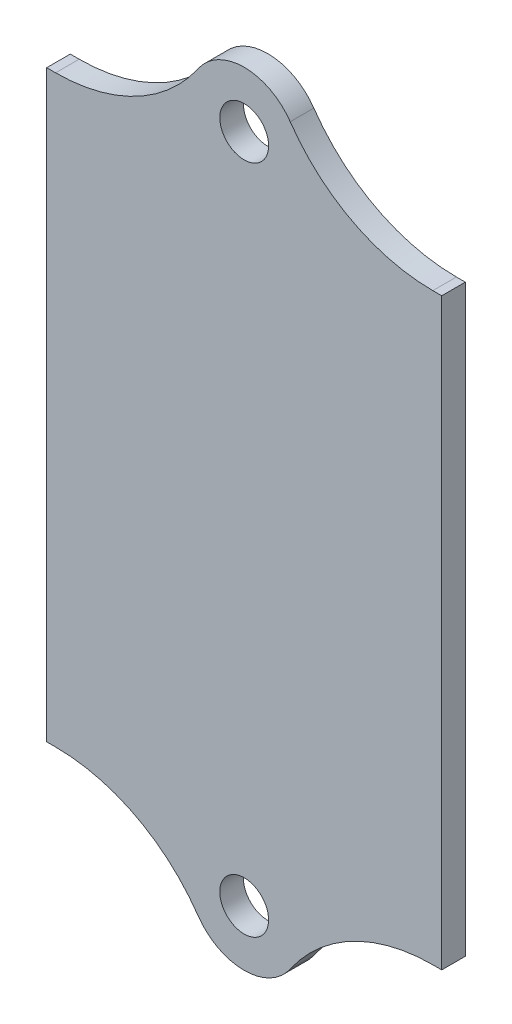
ISO-10303-21;
HEADER;
FILE_DESCRIPTION(('STEP AP214'),'2;1');
FILE_NAME('part.step','',(''),(''),'','','');
FILE_SCHEMA(('AUTOMOTIVE_DESIGN { 1 0 10303 214 1 1 1 1 }'));
ENDSEC;
DATA;
#1=APPLICATION_CONTEXT('core data for automotive mechanical design processes');
#2=APPLICATION_PROTOCOL_DEFINITION('international standard','automotive_design',2000,#1);
#3=PRODUCT_CONTEXT('',#1,'mechanical');
#4=PRODUCT('Part','Part','',(#3));
#5=PRODUCT_RELATED_PRODUCT_CATEGORY('part','',(#4));
#6=PRODUCT_DEFINITION_FORMATION('','',#4);
#7=PRODUCT_DEFINITION_CONTEXT('part definition',#1,'design');
#8=PRODUCT_DEFINITION('design','',#6,#7);
#9=PRODUCT_DEFINITION_SHAPE('','',#8);
#10=(LENGTH_UNIT() NAMED_UNIT(*) SI_UNIT(.MILLI.,.METRE.));
#11=(NAMED_UNIT(*) PLANE_ANGLE_UNIT() SI_UNIT($,.RADIAN.));
#12=(NAMED_UNIT(*) SI_UNIT($,.STERADIAN.) SOLID_ANGLE_UNIT());
#13=UNCERTAINTY_MEASURE_WITH_UNIT(LENGTH_MEASURE(1.E-05),#10,'distance_accuracy_value','');
#14=(GEOMETRIC_REPRESENTATION_CONTEXT(3) GLOBAL_UNCERTAINTY_ASSIGNED_CONTEXT((#13)) GLOBAL_UNIT_ASSIGNED_CONTEXT((#10,
#11,#12)) REPRESENTATION_CONTEXT('',''));
#15=CARTESIAN_POINT('',(0.,0.,0.));
#16=DIRECTION('',(0.,0.,1.));
#17=DIRECTION('',(1.,0.,0.));
#18=AXIS2_PLACEMENT_3D('',#15,#16,#17);
#19=CARTESIAN_POINT('',(14.1836690318087,56.1,1.5));
#20=DIRECTION('',(0.,0.,-1.));
#21=DIRECTION('',(-1.,0.,0.));
#22=AXIS2_PLACEMENT_3D('',#19,#20,#21);
#23=CYLINDRICAL_SURFACE('',#22,11.);
#24=CARTESIAN_POINT('',(14.1836690318087,56.1,0.));
#25=DIRECTION('',(0.,0.,-1.));
#26=DIRECTION('',(1.,0.,0.));
#27=AXIS2_PLACEMENT_3D('',#24,#25,#26);
#28=CIRCLE('',#27,11.);
#29=CARTESIAN_POINT('',(14.1836690318087,45.1,0.));
#30=VERTEX_POINT('',#29);
#31=CARTESIAN_POINT('',(5.12285138604295,49.8628865979381,0.));
#32=VERTEX_POINT('',#31);
#33=EDGE_CURVE('E156',#30,#32,#28,.T.);
#34=ORIENTED_EDGE('',*,*,#33,.T.);
#35=DIRECTION('',(0.,0.,-1.));
#36=VECTOR('',#35,1.);
#37=CARTESIAN_POINT('',(5.12285138604295,49.8628865979381,1.5));
#38=LINE('',#37,#36);
#39=CARTESIAN_POINT('',(5.12285138604295,49.8628865979381,1.5));
#40=VERTEX_POINT('',#39);
#41=EDGE_CURVE('E11',#40,#32,#38,.T.);
#42=ORIENTED_EDGE('',*,*,#41,.F.);
#43=CARTESIAN_POINT('',(14.1836690318087,56.1,1.5));
#44=DIRECTION('',(0.,0.,-1.));
#45=DIRECTION('',(1.,0.,0.));
#46=AXIS2_PLACEMENT_3D('',#43,#44,#45);
#47=CIRCLE('',#46,11.);
#48=CARTESIAN_POINT('',(14.1836690318087,45.1,1.5));
#49=VERTEX_POINT('',#48);
#50=EDGE_CURVE('E181',#49,#40,#47,.T.);
#51=ORIENTED_EDGE('',*,*,#50,.F.);
#52=DIRECTION('',(0.,0.,-1.));
#53=VECTOR('',#52,1.);
#54=CARTESIAN_POINT('',(14.1836690318087,45.1,1.5));
#55=LINE('',#54,#53);
#56=EDGE_CURVE('E152',#49,#30,#55,.T.);
#57=ORIENTED_EDGE('',*,*,#56,.T.);
#58=EDGE_LOOP('',(#34,#42,#51,#57));
#59=FACE_BOUND('',#58,.T.);
#60=ADVANCED_FACE('F35',(#59),#23,.F.);
#61=CARTESIAN_POINT('',(2.19867841854582,47.85,1.5));
#62=DIRECTION('',(0.,0.,-1.));
#63=DIRECTION('',(-1.,0.,0.));
#64=AXIS2_PLACEMENT_3D('',#61,#62,#63);
#65=CYLINDRICAL_SURFACE('',#64,3.55);
#66=CARTESIAN_POINT('',(2.19867841854582,47.85,0.));
#67=DIRECTION('',(0.,0.,1.));
#68=DIRECTION('',(1.,0.,0.));
#69=AXIS2_PLACEMENT_3D('',#66,#67,#68);
#70=CIRCLE('',#69,3.55);
#71=CARTESIAN_POINT('',(-0.725494548951331,49.8628865979381,0.));
#72=VERTEX_POINT('',#71);
#73=EDGE_CURVE('E159',#32,#72,#70,.T.);
#74=ORIENTED_EDGE('',*,*,#73,.T.);
#75=DIRECTION('',(0.,0.,-1.));
#76=VECTOR('',#75,1.);
#77=CARTESIAN_POINT('',(-0.725494548951331,49.8628865979381,1.5));
#78=LINE('',#77,#76);
#79=CARTESIAN_POINT('',(-0.725494548951331,49.8628865979381,1.5));
#80=VERTEX_POINT('',#79);
#81=EDGE_CURVE('E43',#80,#72,#78,.T.);
#82=ORIENTED_EDGE('',*,*,#81,.F.);
#83=CARTESIAN_POINT('',(2.19867841854582,47.85,1.5));
#84=DIRECTION('',(0.,0.,1.));
#85=DIRECTION('',(1.,0.,0.));
#86=AXIS2_PLACEMENT_3D('',#83,#84,#85);
#87=CIRCLE('',#86,3.55);
#88=EDGE_CURVE('E103',#40,#80,#87,.T.);
#89=ORIENTED_EDGE('',*,*,#88,.F.);
#90=ORIENTED_EDGE('',*,*,#41,.T.);
#91=EDGE_LOOP('',(#74,#82,#89,#90));
#92=FACE_BOUND('',#91,.T.);
#93=ADVANCED_FACE('F284',(#92),#65,.T.);
#94=CARTESIAN_POINT('',(-9.78631219471709,56.1,1.5));
#95=DIRECTION('',(0.,0.,-1.));
#96=DIRECTION('',(-1.,0.,0.));
#97=AXIS2_PLACEMENT_3D('',#94,#95,#96);
#98=CYLINDRICAL_SURFACE('',#97,11.);
#99=CARTESIAN_POINT('',(-9.78631219471709,56.1,0.));
#100=DIRECTION('',(0.,0.,-1.));
#101=DIRECTION('',(1.,0.,0.));
#102=AXIS2_PLACEMENT_3D('',#99,#100,#101);
#103=CIRCLE('',#102,11.);
#104=CARTESIAN_POINT('',(-9.78631219471709,45.1,0.));
#105=VERTEX_POINT('',#104);
#106=EDGE_CURVE('E162',#72,#105,#103,.T.);
#107=ORIENTED_EDGE('',*,*,#106,.T.);
#108=DIRECTION('',(0.,0.,-1.));
#109=VECTOR('',#108,1.);
#110=CARTESIAN_POINT('',(-9.78631219471709,45.1,1.5));
#111=LINE('',#110,#109);
#112=CARTESIAN_POINT('',(-9.78631219471709,45.1,1.5));
#113=VERTEX_POINT('',#112);
#114=EDGE_CURVE('E200',#113,#105,#111,.T.);
#115=ORIENTED_EDGE('',*,*,#114,.F.);
#116=CARTESIAN_POINT('',(-9.78631219471709,56.1,1.5));
#117=DIRECTION('',(0.,0.,-1.));
#118=DIRECTION('',(1.,0.,0.));
#119=AXIS2_PLACEMENT_3D('',#116,#117,#118);
#120=CIRCLE('',#119,11.);
#121=EDGE_CURVE('E208',#80,#113,#120,.T.);
#122=ORIENTED_EDGE('',*,*,#121,.F.);
#123=ORIENTED_EDGE('',*,*,#81,.T.);
#124=EDGE_LOOP('',(#107,#115,#122,#123));
#125=FACE_BOUND('',#124,.T.);
#126=ADVANCED_FACE('F206',(#125),#98,.F.);
#127=CARTESIAN_POINT('',(-9.92567723443631,45.1,1.5));
#128=DIRECTION('',(0.,-1.,0.));
#129=DIRECTION('',(0.,0.,-1.));
#130=AXIS2_PLACEMENT_3D('',#127,#128,#129);
#131=PLANE('',#130);
#132=DIRECTION('',(-1.,0.,0.));
#133=VECTOR('',#132,1.);
#134=CARTESIAN_POINT('',(-9.92567723443631,45.1,0.));
#135=LINE('',#134,#133);
#136=CARTESIAN_POINT('',(-10.3513215814542,45.1,0.));
#137=VERTEX_POINT('',#136);
#138=EDGE_CURVE('E165',#105,#137,#135,.T.);
#139=ORIENTED_EDGE('',*,*,#138,.T.);
#140=DIRECTION('',(0.,0.,-1.));
#141=VECTOR('',#140,1.);
#142=CARTESIAN_POINT('',(-10.3513215814542,45.1,1.5));
#143=LINE('',#142,#141);
#144=CARTESIAN_POINT('',(-10.3513215814542,45.1,1.5));
#145=VERTEX_POINT('',#144);
#146=EDGE_CURVE('E197',#145,#137,#143,.T.);
#147=ORIENTED_EDGE('',*,*,#146,.F.);
#148=DIRECTION('',(-1.,0.,0.));
#149=VECTOR('',#148,1.);
#150=CARTESIAN_POINT('',(-9.78631219471709,45.1,1.5));
#151=LINE('',#150,#149);
#152=EDGE_CURVE('E223',#113,#145,#151,.T.);
#153=ORIENTED_EDGE('',*,*,#152,.F.);
#154=ORIENTED_EDGE('',*,*,#114,.T.);
#155=EDGE_LOOP('',(#139,#147,#153,#154));
#156=FACE_BOUND('',#155,.T.);
#157=ADVANCED_FACE('F214',(#156),#131,.F.);
#158=CARTESIAN_POINT('',(-10.3513215814542,8.,1.5));
#159=DIRECTION('',(1.,0.,0.));
#160=DIRECTION('',(0.,1.,0.));
#161=AXIS2_PLACEMENT_3D('',#158,#159,#160);
#162=PLANE('',#161);
#163=DIRECTION('',(0.,-1.,0.));
#164=VECTOR('',#163,1.);
#165=CARTESIAN_POINT('',(-10.3513215814542,8.,0.));
#166=LINE('',#165,#164);
#167=CARTESIAN_POINT('',(-10.3513215814542,8.,0.));
#168=VERTEX_POINT('',#167);
#169=EDGE_CURVE('E167',#137,#168,#166,.T.);
#170=ORIENTED_EDGE('',*,*,#169,.T.);
#171=DIRECTION('',(0.,0.,-1.));
#172=VECTOR('',#171,1.);
#173=CARTESIAN_POINT('',(-10.3513215814542,8.,1.5));
#174=LINE('',#173,#172);
#175=CARTESIAN_POINT('',(-10.3513215814542,8.,1.5));
#176=VERTEX_POINT('',#175);
#177=EDGE_CURVE('E194',#176,#168,#174,.T.);
#178=ORIENTED_EDGE('',*,*,#177,.F.);
#179=DIRECTION('',(0.,-1.,0.));
#180=VECTOR('',#179,1.);
#181=CARTESIAN_POINT('',(-10.3513215814542,8.,1.5));
#182=LINE('',#181,#180);
#183=EDGE_CURVE('E220',#145,#176,#182,.T.);
#184=ORIENTED_EDGE('',*,*,#183,.F.);
#185=ORIENTED_EDGE('',*,*,#146,.T.);
#186=EDGE_LOOP('',(#170,#178,#184,#185));
#187=FACE_BOUND('',#186,.T.);
#188=ADVANCED_FACE('F218',(#187),#162,.F.);
#189=CARTESIAN_POINT('',(-10.3513215814542,8.,1.5));
#190=DIRECTION('',(0.,1.,0.));
#191=DIRECTION('',(-1.,0.,0.));
#192=AXIS2_PLACEMENT_3D('',#189,#190,#191);
#193=PLANE('',#192);
#194=DIRECTION('',(1.,0.,0.));
#195=VECTOR('',#194,1.);
#196=CARTESIAN_POINT('',(-10.3513215814542,8.,0.));
#197=LINE('',#196,#195);
#198=CARTESIAN_POINT('',(-9.78631219471708,8.,0.));
#199=VERTEX_POINT('',#198);
#200=EDGE_CURVE('E169',#168,#199,#197,.T.);
#201=ORIENTED_EDGE('',*,*,#200,.T.);
#202=DIRECTION('',(0.,0.,-1.));
#203=VECTOR('',#202,1.);
#204=CARTESIAN_POINT('',(-9.78631219471708,8.,1.5));
#205=LINE('',#204,#203);
#206=CARTESIAN_POINT('',(-9.78631219471708,8.,1.5));
#207=VERTEX_POINT('',#206);
#208=EDGE_CURVE('E191',#207,#199,#205,.T.);
#209=ORIENTED_EDGE('',*,*,#208,.F.);
#210=DIRECTION('',(1.,0.,0.));
#211=VECTOR('',#210,1.);
#212=CARTESIAN_POINT('',(-10.3513215814542,8.,1.5));
#213=LINE('',#212,#211);
#214=EDGE_CURVE('E222',#176,#207,#213,.T.);
#215=ORIENTED_EDGE('',*,*,#214,.F.);
#216=ORIENTED_EDGE('',*,*,#177,.T.);
#217=EDGE_LOOP('',(#201,#209,#215,#216));
#218=FACE_BOUND('',#217,.T.);
#219=ADVANCED_FACE('F297',(#218),#193,.F.);
#220=CARTESIAN_POINT('',(-9.78631219471708,-3.,1.5));
#221=DIRECTION('',(0.,0.,-1.));
#222=DIRECTION('',(-1.,0.,0.));
#223=AXIS2_PLACEMENT_3D('',#220,#221,#222);
#224=CYLINDRICAL_SURFACE('',#223,11.);
#225=CARTESIAN_POINT('',(-9.78631219471708,-3.,0.));
#226=DIRECTION('',(0.,0.,-1.));
#227=DIRECTION('',(1.,0.,0.));
#228=AXIS2_PLACEMENT_3D('',#225,#226,#227);
#229=CIRCLE('',#228,11.);
#230=CARTESIAN_POINT('',(-0.725494548951317,3.23711340206186,0.));
#231=VERTEX_POINT('',#230);
#232=EDGE_CURVE('E171',#199,#231,#229,.T.);
#233=ORIENTED_EDGE('',*,*,#232,.T.);
#234=DIRECTION('',(0.,0.,-1.));
#235=VECTOR('',#234,1.);
#236=CARTESIAN_POINT('',(-0.725494548951317,3.23711340206186,1.5));
#237=LINE('',#236,#235);
#238=CARTESIAN_POINT('',(-0.725494548951317,3.23711340206186,1.5));
#239=VERTEX_POINT('',#238);
#240=EDGE_CURVE('E188',#239,#231,#237,.T.);
#241=ORIENTED_EDGE('',*,*,#240,.F.);
#242=CARTESIAN_POINT('',(-9.78631219471708,-3.,1.5));
#243=DIRECTION('',(0.,0.,-1.));
#244=DIRECTION('',(1.,0.,0.));
#245=AXIS2_PLACEMENT_3D('',#242,#243,#244);
#246=CIRCLE('',#245,11.);
#247=EDGE_CURVE('E225',#207,#239,#246,.T.);
#248=ORIENTED_EDGE('',*,*,#247,.F.);
#249=ORIENTED_EDGE('',*,*,#208,.T.);
#250=EDGE_LOOP('',(#233,#241,#248,#249));
#251=FACE_BOUND('',#250,.T.);
#252=ADVANCED_FACE('F300',(#251),#224,.F.);
#253=CARTESIAN_POINT('',(2.19867841854582,5.25,1.5));
#254=DIRECTION('',(0.,0.,-1.));
#255=DIRECTION('',(-1.,0.,0.));
#256=AXIS2_PLACEMENT_3D('',#253,#254,#255);
#257=CYLINDRICAL_SURFACE('',#256,3.55);
#258=CARTESIAN_POINT('',(2.19867841854582,5.25,0.));
#259=DIRECTION('',(0.,0.,1.));
#260=DIRECTION('',(1.,0.,0.));
#261=AXIS2_PLACEMENT_3D('',#258,#259,#260);
#262=CIRCLE('',#261,3.55);
#263=CARTESIAN_POINT('',(5.12285138604295,3.23711340206186,0.));
#264=VERTEX_POINT('',#263);
#265=EDGE_CURVE('E173',#231,#264,#262,.T.);
#266=ORIENTED_EDGE('',*,*,#265,.T.);
#267=DIRECTION('',(0.,0.,-1.));
#268=VECTOR('',#267,1.);
#269=CARTESIAN_POINT('',(5.12285138604295,3.23711340206186,1.5));
#270=LINE('',#269,#268);
#271=CARTESIAN_POINT('',(5.12285138604295,3.23711340206186,1.5));
#272=VERTEX_POINT('',#271);
#273=EDGE_CURVE('E185',#272,#264,#270,.T.);
#274=ORIENTED_EDGE('',*,*,#273,.F.);
#275=CARTESIAN_POINT('',(2.19867841854582,5.25,1.5));
#276=DIRECTION('',(0.,0.,1.));
#277=DIRECTION('',(1.,0.,0.));
#278=AXIS2_PLACEMENT_3D('',#275,#276,#277);
#279=CIRCLE('',#278,3.55);
#280=EDGE_CURVE('E231',#239,#272,#279,.T.);
#281=ORIENTED_EDGE('',*,*,#280,.F.);
#282=ORIENTED_EDGE('',*,*,#240,.T.);
#283=EDGE_LOOP('',(#266,#274,#281,#282));
#284=FACE_BOUND('',#283,.T.);
#285=ADVANCED_FACE('F237',(#284),#257,.T.);
#286=CARTESIAN_POINT('',(14.1836690318087,-3.,1.5));
#287=DIRECTION('',(0.,0.,-1.));
#288=DIRECTION('',(-1.,0.,0.));
#289=AXIS2_PLACEMENT_3D('',#286,#287,#288);
#290=CYLINDRICAL_SURFACE('',#289,11.);
#291=CARTESIAN_POINT('',(14.1836690318087,-3.,0.));
#292=DIRECTION('',(0.,0.,-1.));
#293=DIRECTION('',(1.,0.,0.));
#294=AXIS2_PLACEMENT_3D('',#291,#292,#293);
#295=CIRCLE('',#294,11.);
#296=CARTESIAN_POINT('',(14.1836690318087,8.,0.));
#297=VERTEX_POINT('',#296);
#298=EDGE_CURVE('E175',#264,#297,#295,.T.);
#299=ORIENTED_EDGE('',*,*,#298,.T.);
#300=DIRECTION('',(0.,0.,-1.));
#301=VECTOR('',#300,1.);
#302=CARTESIAN_POINT('',(14.1836690318087,8.,1.5));
#303=LINE('',#302,#301);
#304=CARTESIAN_POINT('',(14.1836690318087,8.,1.5));
#305=VERTEX_POINT('',#304);
#306=EDGE_CURVE('E147',#305,#297,#303,.T.);
#307=ORIENTED_EDGE('',*,*,#306,.F.);
#308=CARTESIAN_POINT('',(14.1836690318087,-3.,1.5));
#309=DIRECTION('',(0.,0.,-1.));
#310=DIRECTION('',(1.,0.,0.));
#311=AXIS2_PLACEMENT_3D('',#308,#309,#310);
#312=CIRCLE('',#311,11.);
#313=EDGE_CURVE('E135',#272,#305,#312,.T.);
#314=ORIENTED_EDGE('',*,*,#313,.F.);
#315=ORIENTED_EDGE('',*,*,#273,.T.);
#316=EDGE_LOOP('',(#299,#307,#314,#315));
#317=FACE_BOUND('',#316,.T.);
#318=ADVANCED_FACE('F241',(#317),#290,.F.);
#319=CARTESIAN_POINT('',(14.1836690318087,8.,1.5));
#320=DIRECTION('',(0.,1.,0.));
#321=DIRECTION('',(0.,0.,1.));
#322=AXIS2_PLACEMENT_3D('',#319,#320,#321);
#323=PLANE('',#322);
#324=DIRECTION('',(1.,0.,0.));
#325=VECTOR('',#324,1.);
#326=CARTESIAN_POINT('',(14.1836690318087,8.,0.));
#327=LINE('',#326,#325);
#328=CARTESIAN_POINT('',(14.7486784185458,8.,0.));
#329=VERTEX_POINT('',#328);
#330=EDGE_CURVE('E145',#297,#329,#327,.T.);
#331=ORIENTED_EDGE('',*,*,#330,.T.);
#332=DIRECTION('',(0.,0.,-1.));
#333=VECTOR('',#332,1.);
#334=CARTESIAN_POINT('',(14.7486784185458,8.,1.5));
#335=LINE('',#334,#333);
#336=CARTESIAN_POINT('',(14.7486784185458,8.,1.5));
#337=VERTEX_POINT('',#336);
#338=EDGE_CURVE('E142',#337,#329,#335,.T.);
#339=ORIENTED_EDGE('',*,*,#338,.F.);
#340=DIRECTION('',(1.,0.,0.));
#341=VECTOR('',#340,1.);
#342=CARTESIAN_POINT('',(14.1836690318087,8.,1.5));
#343=LINE('',#342,#341);
#344=EDGE_CURVE('E128',#305,#337,#343,.T.);
#345=ORIENTED_EDGE('',*,*,#344,.F.);
#346=ORIENTED_EDGE('',*,*,#306,.T.);
#347=EDGE_LOOP('',(#331,#339,#345,#346));
#348=FACE_BOUND('',#347,.T.);
#349=ADVANCED_FACE('F143',(#348),#323,.F.);
#350=CARTESIAN_POINT('',(14.7486784185458,45.1,1.5));
#351=DIRECTION('',(-1.,0.,0.));
#352=DIRECTION('',(0.,-1.,0.));
#353=AXIS2_PLACEMENT_3D('',#350,#351,#352);
#354=PLANE('',#353);
#355=DIRECTION('',(0.,1.,0.));
#356=VECTOR('',#355,1.);
#357=CARTESIAN_POINT('',(14.7486784185458,45.1,0.));
#358=LINE('',#357,#356);
#359=CARTESIAN_POINT('',(14.7486784185458,45.1,0.));
#360=VERTEX_POINT('',#359);
#361=EDGE_CURVE('E178',#329,#360,#358,.T.);
#362=ORIENTED_EDGE('',*,*,#361,.T.);
#363=DIRECTION('',(0.,0.,-1.));
#364=VECTOR('',#363,1.);
#365=CARTESIAN_POINT('',(14.7486784185458,45.1,1.5));
#366=LINE('',#365,#364);
#367=CARTESIAN_POINT('',(14.7486784185458,45.1,1.5));
#368=VERTEX_POINT('',#367);
#369=EDGE_CURVE('E148',#368,#360,#366,.T.);
#370=ORIENTED_EDGE('',*,*,#369,.F.);
#371=DIRECTION('',(0.,1.,0.));
#372=VECTOR('',#371,1.);
#373=CARTESIAN_POINT('',(14.7486784185458,8.,1.5));
#374=LINE('',#373,#372);
#375=EDGE_CURVE('E132',#337,#368,#374,.T.);
#376=ORIENTED_EDGE('',*,*,#375,.F.);
#377=ORIENTED_EDGE('',*,*,#338,.T.);
#378=EDGE_LOOP('',(#362,#370,#376,#377));
#379=FACE_BOUND('',#378,.T.);
#380=ADVANCED_FACE('F150',(#379),#354,.F.);
#381=CARTESIAN_POINT('',(14.3230340715279,45.1,1.5));
#382=DIRECTION('',(0.,-1.,0.));
#383=DIRECTION('',(0.,0.,-1.));
#384=AXIS2_PLACEMENT_3D('',#381,#382,#383);
#385=PLANE('',#384);
#386=DIRECTION('',(-1.,0.,0.));
#387=VECTOR('',#386,1.);
#388=CARTESIAN_POINT('',(14.3230340715279,45.1,0.));
#389=LINE('',#388,#387);
#390=EDGE_CURVE('E91',#360,#30,#389,.T.);
#391=ORIENTED_EDGE('',*,*,#390,.T.);
#392=ORIENTED_EDGE('',*,*,#56,.F.);
#393=DIRECTION('',(-1.,0.,0.));
#394=VECTOR('',#393,1.);
#395=CARTESIAN_POINT('',(14.7486784185458,45.1,1.5));
#396=LINE('',#395,#394);
#397=EDGE_CURVE('E51',#368,#49,#396,.T.);
#398=ORIENTED_EDGE('',*,*,#397,.F.);
#399=ORIENTED_EDGE('',*,*,#369,.T.);
#400=EDGE_LOOP('',(#391,#392,#398,#399));
#401=FACE_BOUND('',#400,.T.);
#402=ADVANCED_FACE('F242',(#401),#385,.F.);
#403=CARTESIAN_POINT('',(14.1836690318087,56.1,1.5));
#404=DIRECTION('',(0.,0.,1.));
#405=DIRECTION('',(1.,0.,0.));
#406=AXIS2_PLACEMENT_3D('',#403,#404,#405);
#407=PLANE('',#406);
#408=CARTESIAN_POINT('',(2.19867841854582,47.85,1.5));
#409=DIRECTION('',(0.,0.,1.));
#410=DIRECTION('',(1.,0.,0.));
#411=AXIS2_PLACEMENT_3D('',#408,#409,#410);
#412=CIRCLE('',#411,1.55000000000001);
#413=CARTESIAN_POINT('',(3.74867841854582,47.85,1.5));
#414=VERTEX_POINT('',#413);
#415=EDGE_CURVE('E255',#414,#414,#412,.T.);
#416=ORIENTED_EDGE('',*,*,#415,.F.);
#417=EDGE_LOOP('',(#416));
#418=FACE_BOUND('',#417,.T.);
#419=CARTESIAN_POINT('',(2.19867841854582,5.25,1.5));
#420=DIRECTION('',(0.,0.,1.));
#421=DIRECTION('',(1.,0.,0.));
#422=AXIS2_PLACEMENT_3D('',#419,#420,#421);
#423=CIRCLE('',#422,1.55);
#424=CARTESIAN_POINT('',(3.74867841854582,5.25,1.5));
#425=VERTEX_POINT('',#424);
#426=EDGE_CURVE('E249',#425,#425,#423,.T.);
#427=ORIENTED_EDGE('',*,*,#426,.F.);
#428=EDGE_LOOP('',(#427));
#429=FACE_BOUND('',#428,.T.);
#430=ORIENTED_EDGE('',*,*,#50,.T.);
#431=ORIENTED_EDGE('',*,*,#88,.T.);
#432=ORIENTED_EDGE('',*,*,#121,.T.);
#433=ORIENTED_EDGE('',*,*,#152,.T.);
#434=ORIENTED_EDGE('',*,*,#183,.T.);
#435=ORIENTED_EDGE('',*,*,#214,.T.);
#436=ORIENTED_EDGE('',*,*,#247,.T.);
#437=ORIENTED_EDGE('',*,*,#280,.T.);
#438=ORIENTED_EDGE('',*,*,#313,.T.);
#439=ORIENTED_EDGE('',*,*,#344,.T.);
#440=ORIENTED_EDGE('',*,*,#375,.T.);
#441=ORIENTED_EDGE('',*,*,#397,.T.);
#442=EDGE_LOOP('',(#430,#431,#432,#433,#434,#435,#436,#437,#438,#439,#440,#441));
#443=FACE_BOUND('',#442,.T.);
#444=ADVANCED_FACE('F130',(#418,#429,#443),#407,.T.);
#445=CARTESIAN_POINT('',(14.1836690318087,56.1,0.));
#446=DIRECTION('',(0.,0.,1.));
#447=DIRECTION('',(1.,0.,0.));
#448=AXIS2_PLACEMENT_3D('',#445,#446,#447);
#449=PLANE('',#448);
#450=CARTESIAN_POINT('',(2.19867841854582,47.85,0.));
#451=DIRECTION('',(0.,0.,1.));
#452=DIRECTION('',(1.,0.,0.));
#453=AXIS2_PLACEMENT_3D('',#450,#451,#452);
#454=CIRCLE('',#453,1.55000000000001);
#455=CARTESIAN_POINT('',(3.74867841854582,47.85,0.));
#456=VERTEX_POINT('',#455);
#457=EDGE_CURVE('E160',#456,#456,#454,.T.);
#458=ORIENTED_EDGE('',*,*,#457,.T.);
#459=EDGE_LOOP('',(#458));
#460=FACE_BOUND('',#459,.T.);
#461=CARTESIAN_POINT('',(2.19867841854582,5.25,0.));
#462=DIRECTION('',(0.,0.,1.));
#463=DIRECTION('',(1.,0.,0.));
#464=AXIS2_PLACEMENT_3D('',#461,#462,#463);
#465=CIRCLE('',#464,1.55);
#466=CARTESIAN_POINT('',(3.74867841854582,5.25,0.));
#467=VERTEX_POINT('',#466);
#468=EDGE_CURVE('E252',#467,#467,#465,.T.);
#469=ORIENTED_EDGE('',*,*,#468,.T.);
#470=EDGE_LOOP('',(#469));
#471=FACE_BOUND('',#470,.T.);
#472=ORIENTED_EDGE('',*,*,#33,.F.);
#473=ORIENTED_EDGE('',*,*,#390,.F.);
#474=ORIENTED_EDGE('',*,*,#361,.F.);
#475=ORIENTED_EDGE('',*,*,#330,.F.);
#476=ORIENTED_EDGE('',*,*,#298,.F.);
#477=ORIENTED_EDGE('',*,*,#265,.F.);
#478=ORIENTED_EDGE('',*,*,#232,.F.);
#479=ORIENTED_EDGE('',*,*,#200,.F.);
#480=ORIENTED_EDGE('',*,*,#169,.F.);
#481=ORIENTED_EDGE('',*,*,#138,.F.);
#482=ORIENTED_EDGE('',*,*,#106,.F.);
#483=ORIENTED_EDGE('',*,*,#73,.F.);
#484=EDGE_LOOP('',(#472,#473,#474,#475,#476,#477,#478,#479,#480,#481,#482,#483));
#485=FACE_BOUND('',#484,.T.);
#486=ADVANCED_FACE('F209',(#460,#471,#485),#449,.F.);
#487=CARTESIAN_POINT('',(2.19867841854582,5.25,0.));
#488=DIRECTION('',(0.,0.,1.));
#489=DIRECTION('',(1.,0.,0.));
#490=AXIS2_PLACEMENT_3D('',#487,#488,#489);
#491=CYLINDRICAL_SURFACE('',#490,1.55);
#492=ORIENTED_EDGE('',*,*,#468,.F.);
#493=EDGE_LOOP('',(#492));
#494=FACE_BOUND('',#493,.T.);
#495=ORIENTED_EDGE('',*,*,#426,.T.);
#496=EDGE_LOOP('',(#495));
#497=FACE_BOUND('',#496,.T.);
#498=ADVANCED_FACE('F266',(#494,#497),#491,.F.);
#499=CARTESIAN_POINT('',(2.19867841854582,47.85,0.));
#500=DIRECTION('',(0.,0.,1.));
#501=DIRECTION('',(1.,0.,0.));
#502=AXIS2_PLACEMENT_3D('',#499,#500,#501);
#503=CYLINDRICAL_SURFACE('',#502,1.55000000000001);
#504=ORIENTED_EDGE('',*,*,#457,.F.);
#505=EDGE_LOOP('',(#504));
#506=FACE_BOUND('',#505,.T.);
#507=ORIENTED_EDGE('',*,*,#415,.T.);
#508=EDGE_LOOP('',(#507));
#509=FACE_BOUND('',#508,.T.);
#510=ADVANCED_FACE('F263',(#506,#509),#503,.F.);
#511=CLOSED_SHELL('',(#60,#93,#126,#157,#188,#219,#252,#285,#318,#349,#380,#402,#444,#486,#498,#510));
#512=MANIFOLD_SOLID_BREP('B2',#511);
#513=ADVANCED_BREP_SHAPE_REPRESENTATION('',(#18,#512),#14);
#514=SHAPE_DEFINITION_REPRESENTATION(#9,#513);
ENDSEC;
END-ISO-10303-21;
